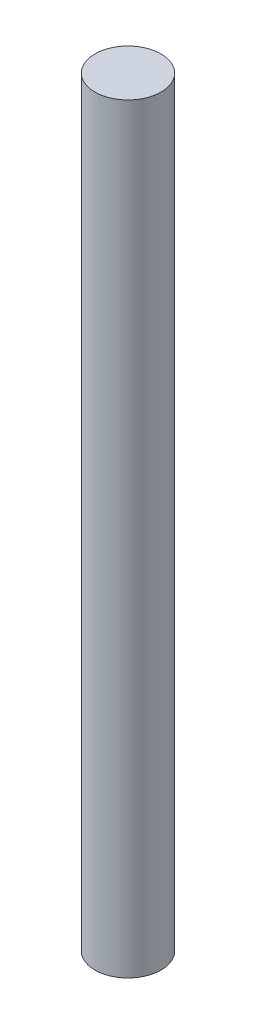
ISO-10303-21;
HEADER;
FILE_DESCRIPTION(('STEP AP214'),'2;1');
FILE_NAME('part.step','',(''),(''),'','','');
FILE_SCHEMA(('AUTOMOTIVE_DESIGN { 1 0 10303 214 1 1 1 1 }'));
ENDSEC;
DATA;
#1=APPLICATION_CONTEXT('core data for automotive mechanical design processes');
#2=APPLICATION_PROTOCOL_DEFINITION('international standard','automotive_design',2000,#1);
#3=PRODUCT_CONTEXT('',#1,'mechanical');
#4=PRODUCT('Part','Part','',(#3));
#5=PRODUCT_RELATED_PRODUCT_CATEGORY('part','',(#4));
#6=PRODUCT_DEFINITION_FORMATION('','',#4);
#7=PRODUCT_DEFINITION_CONTEXT('part definition',#1,'design');
#8=PRODUCT_DEFINITION('design','',#6,#7);
#9=PRODUCT_DEFINITION_SHAPE('','',#8);
#10=(LENGTH_UNIT() NAMED_UNIT(*) SI_UNIT(.MILLI.,.METRE.));
#11=(NAMED_UNIT(*) PLANE_ANGLE_UNIT() SI_UNIT($,.RADIAN.));
#12=(NAMED_UNIT(*) SI_UNIT($,.STERADIAN.) SOLID_ANGLE_UNIT());
#13=UNCERTAINTY_MEASURE_WITH_UNIT(LENGTH_MEASURE(1.E-05),#10,'distance_accuracy_value','');
#14=(GEOMETRIC_REPRESENTATION_CONTEXT(3) GLOBAL_UNCERTAINTY_ASSIGNED_CONTEXT((#13)) GLOBAL_UNIT_ASSIGNED_CONTEXT((#10,
#11,#12)) REPRESENTATION_CONTEXT('',''));
#15=CARTESIAN_POINT('',(0.,0.,0.));
#16=DIRECTION('',(0.,0.,1.));
#17=DIRECTION('',(1.,0.,0.));
#18=AXIS2_PLACEMENT_3D('',#15,#16,#17);
#19=CARTESIAN_POINT('',(0.,92.,0.));
#20=DIRECTION('',(0.,-1.,0.));
#21=DIRECTION('',(0.,0.,-1.));
#22=AXIS2_PLACEMENT_3D('',#19,#20,#21);
#23=CYLINDRICAL_SURFACE('',#22,4.);
#24=CARTESIAN_POINT('',(0.,92.,0.));
#25=DIRECTION('',(0.,1.,0.));
#26=DIRECTION('',(0.,0.,1.));
#27=AXIS2_PLACEMENT_3D('',#24,#25,#26);
#28=CIRCLE('',#27,4.);
#29=CARTESIAN_POINT('',(0.,92.,4.));
#30=VERTEX_POINT('',#29);
#31=EDGE_CURVE('E10',#30,#30,#28,.T.);
#32=ORIENTED_EDGE('',*,*,#31,.F.);
#33=EDGE_LOOP('',(#32));
#34=FACE_BOUND('',#33,.T.);
#35=CARTESIAN_POINT('',(0.,0.,0.));
#36=DIRECTION('',(0.,1.,0.));
#37=DIRECTION('',(0.,0.,1.));
#38=AXIS2_PLACEMENT_3D('',#35,#36,#37);
#39=CIRCLE('',#38,4.);
#40=CARTESIAN_POINT('',(0.,0.,4.));
#41=VERTEX_POINT('',#40);
#42=EDGE_CURVE('E37',#41,#41,#39,.T.);
#43=ORIENTED_EDGE('',*,*,#42,.T.);
#44=EDGE_LOOP('',(#43));
#45=FACE_BOUND('',#44,.T.);
#46=ADVANCED_FACE('F34',(#34,#45),#23,.T.);
#47=CARTESIAN_POINT('',(0.,92.,0.));
#48=DIRECTION('',(0.,1.,0.));
#49=DIRECTION('',(0.,0.,1.));
#50=AXIS2_PLACEMENT_3D('',#47,#48,#49);
#51=PLANE('',#50);
#52=ORIENTED_EDGE('',*,*,#31,.T.);
#53=EDGE_LOOP('',(#52));
#54=FACE_BOUND('',#53,.T.);
#55=ADVANCED_FACE('F49',(#54),#51,.T.);
#56=CARTESIAN_POINT('',(0.,0.,0.));
#57=DIRECTION('',(0.,1.,0.));
#58=DIRECTION('',(0.,0.,1.));
#59=AXIS2_PLACEMENT_3D('',#56,#57,#58);
#60=PLANE('',#59);
#61=ORIENTED_EDGE('',*,*,#42,.F.);
#62=EDGE_LOOP('',(#61));
#63=FACE_BOUND('',#62,.T.);
#64=ADVANCED_FACE('F47',(#63),#60,.F.);
#65=CLOSED_SHELL('',(#46,#55,#64));
#66=MANIFOLD_SOLID_BREP('B2',#65);
#67=ADVANCED_BREP_SHAPE_REPRESENTATION('',(#18,#66),#14);
#68=SHAPE_DEFINITION_REPRESENTATION(#9,#67);
ENDSEC;
END-ISO-10303-21;
